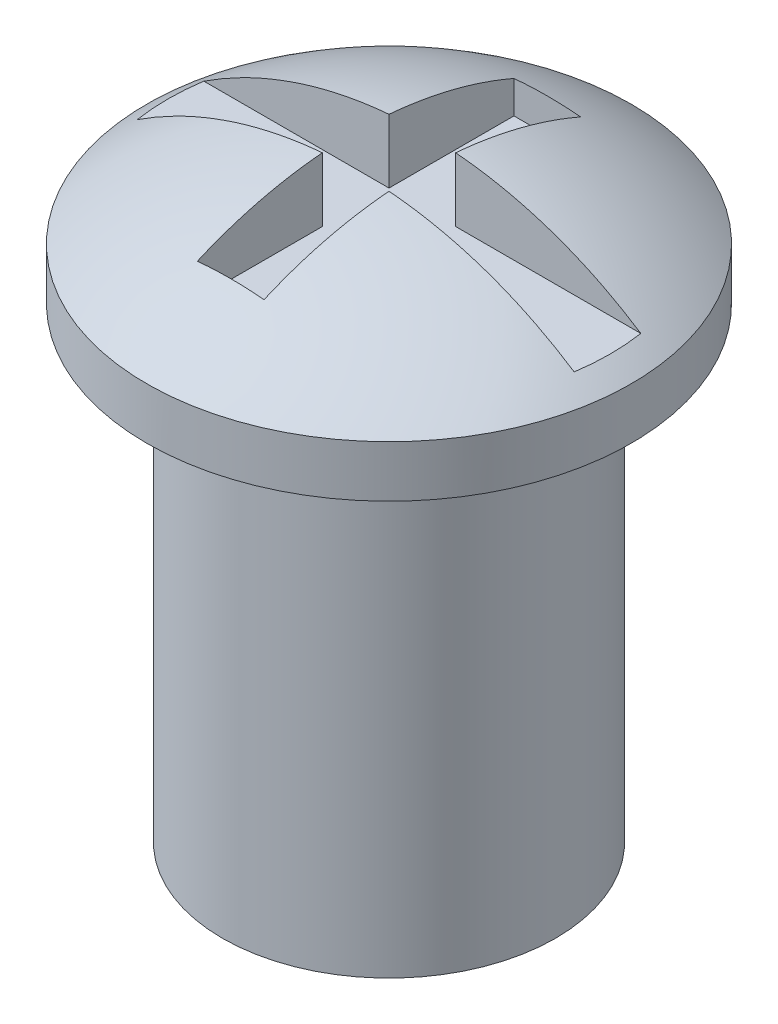
ISO-10303-21;
HEADER;
FILE_DESCRIPTION(('STEP AP214'),'2;1');
FILE_NAME('part.step','',(''),(''),'','','');
FILE_SCHEMA(('AUTOMOTIVE_DESIGN { 1 0 10303 214 1 1 1 1 }'));
ENDSEC;
DATA;
#1=APPLICATION_CONTEXT('core data for automotive mechanical design processes');
#2=APPLICATION_PROTOCOL_DEFINITION('international standard','automotive_design',2000,#1);
#3=PRODUCT_CONTEXT('',#1,'mechanical');
#4=PRODUCT('Part','Part','',(#3));
#5=PRODUCT_RELATED_PRODUCT_CATEGORY('part','',(#4));
#6=PRODUCT_DEFINITION_FORMATION('','',#4);
#7=PRODUCT_DEFINITION_CONTEXT('part definition',#1,'design');
#8=PRODUCT_DEFINITION('design','',#6,#7);
#9=PRODUCT_DEFINITION_SHAPE('','',#8);
#10=(LENGTH_UNIT() NAMED_UNIT(*) SI_UNIT(.MILLI.,.METRE.));
#11=(NAMED_UNIT(*) PLANE_ANGLE_UNIT() SI_UNIT($,.RADIAN.));
#12=(NAMED_UNIT(*) SI_UNIT($,.STERADIAN.) SOLID_ANGLE_UNIT());
#13=UNCERTAINTY_MEASURE_WITH_UNIT(LENGTH_MEASURE(1.E-05),#10,'distance_accuracy_value','');
#14=(GEOMETRIC_REPRESENTATION_CONTEXT(3) GLOBAL_UNCERTAINTY_ASSIGNED_CONTEXT((#13)) GLOBAL_UNIT_ASSIGNED_CONTEXT((#10,
#11,#12)) REPRESENTATION_CONTEXT('',''));
#15=CARTESIAN_POINT('',(0.,0.,0.));
#16=DIRECTION('',(0.,0.,1.));
#17=DIRECTION('',(1.,0.,0.));
#18=AXIS2_PLACEMENT_3D('',#15,#16,#17);
#19=CARTESIAN_POINT('',(0.,9.,0.));
#20=DIRECTION('',(0.,-1.,0.));
#21=DIRECTION('',(0.,0.,-1.));
#22=AXIS2_PLACEMENT_3D('',#19,#20,#21);
#23=CYLINDRICAL_SURFACE('',#22,3.635);
#24=CARTESIAN_POINT('',(0.,7.,0.));
#25=DIRECTION('',(0.,1.,0.));
#26=DIRECTION('',(0.,0.,1.));
#27=AXIS2_PLACEMENT_3D('',#24,#25,#26);
#28=CIRCLE('',#27,3.635);
#29=CARTESIAN_POINT('',(0.,7.,3.635));
#30=VERTEX_POINT('',#29);
#31=EDGE_CURVE('E149',#30,#30,#28,.T.);
#32=ORIENTED_EDGE('',*,*,#31,.T.);
#33=EDGE_LOOP('',(#32));
#34=FACE_BOUND('',#33,.T.);
#35=CARTESIAN_POINT('',(0.,7.77354951791641,0.));
#36=DIRECTION('',(0.,-1.,0.));
#37=DIRECTION('',(0.,0.,-1.));
#38=AXIS2_PLACEMENT_3D('',#35,#36,#37);
#39=CIRCLE('',#38,3.635);
#40=CARTESIAN_POINT('',(0.,7.77354951791641,-3.635));
#41=VERTEX_POINT('',#40);
#42=EDGE_CURVE('E175',#41,#41,#39,.F.);
#43=ORIENTED_EDGE('',*,*,#42,.F.);
#44=EDGE_LOOP('',(#43));
#45=FACE_BOUND('',#44,.T.);
#46=ADVANCED_FACE('F33',(#34,#45),#23,.T.);
#47=CARTESIAN_POINT('',(0.,7.,0.));
#48=DIRECTION('',(0.,-1.,0.));
#49=DIRECTION('',(0.,0.,-1.));
#50=AXIS2_PLACEMENT_3D('',#47,#48,#49);
#51=CYLINDRICAL_SURFACE('',#50,2.5);
#52=CARTESIAN_POINT('',(0.,7.,0.));
#53=DIRECTION('',(0.,1.,0.));
#54=DIRECTION('',(0.,0.,1.));
#55=AXIS2_PLACEMENT_3D('',#52,#53,#54);
#56=CIRCLE('',#55,2.5);
#57=CARTESIAN_POINT('',(0.,7.,2.5));
#58=VERTEX_POINT('',#57);
#59=EDGE_CURVE('E153',#58,#58,#56,.T.);
#60=ORIENTED_EDGE('',*,*,#59,.F.);
#61=EDGE_LOOP('',(#60));
#62=FACE_BOUND('',#61,.T.);
#63=CARTESIAN_POINT('',(0.,0.,0.));
#64=DIRECTION('',(0.,1.,0.));
#65=DIRECTION('',(0.,0.,1.));
#66=AXIS2_PLACEMENT_3D('',#63,#64,#65);
#67=CIRCLE('',#66,2.5);
#68=CARTESIAN_POINT('',(0.,0.,2.5));
#69=VERTEX_POINT('',#68);
#70=EDGE_CURVE('E152',#69,#69,#67,.T.);
#71=ORIENTED_EDGE('',*,*,#70,.T.);
#72=EDGE_LOOP('',(#71));
#73=FACE_BOUND('',#72,.T.);
#74=ADVANCED_FACE('F35',(#62,#73),#51,.T.);
#75=CARTESIAN_POINT('',(0.,0.,0.));
#76=DIRECTION('',(0.,1.,0.));
#77=DIRECTION('',(0.,0.,1.));
#78=AXIS2_PLACEMENT_3D('',#75,#76,#77);
#79=PLANE('',#78);
#80=ORIENTED_EDGE('',*,*,#70,.F.);
#81=EDGE_LOOP('',(#80));
#82=FACE_BOUND('',#81,.T.);
#83=ADVANCED_FACE('F237',(#82),#79,.F.);
#84=CARTESIAN_POINT('',(0.,7.,0.));
#85=DIRECTION('',(0.,1.,0.));
#86=DIRECTION('',(0.,0.,1.));
#87=AXIS2_PLACEMENT_3D('',#84,#85,#86);
#88=PLANE('',#87);
#89=ORIENTED_EDGE('',*,*,#31,.F.);
#90=EDGE_LOOP('',(#89));
#91=FACE_BOUND('',#90,.T.);
#92=ORIENTED_EDGE('',*,*,#59,.T.);
#93=EDGE_LOOP('',(#92));
#94=FACE_BOUND('',#93,.T.);
#95=ADVANCED_FACE('F240',(#91,#94),#88,.F.);
#96=CARTESIAN_POINT('',(0.,3.,0.));
#97=DIRECTION('',(0.,-1.,0.));
#98=DIRECTION('',(0.,0.,1.));
#99=AXIS2_PLACEMENT_3D('',#96,#97,#98);
#100=SPHERICAL_SURFACE('',#99,6.);
#101=CARTESIAN_POINT('',(0.,3.,2.375));
#102=DIRECTION('',(0.,0.,1.));
#103=DIRECTION('',(1.,0.,0.));
#104=AXIS2_PLACEMENT_3D('',#101,#102,#103);
#105=CIRCLE('',#104,5.50993421013355);
#106=CARTESIAN_POINT('',(0.499999999999999,8.48720101691199,2.375));
#107=VERTEX_POINT('',#106);
#108=CARTESIAN_POINT('',(-0.499999999999999,8.48720101691199,2.375));
#109=VERTEX_POINT('',#108);
#110=EDGE_CURVE('E179',#107,#109,#105,.T.);
#111=ORIENTED_EDGE('',*,*,#110,.T.);
#112=CARTESIAN_POINT('',(-0.5,3.,0.));
#113=DIRECTION('',(-1.,0.,0.));
#114=DIRECTION('',(0.,0.,1.));
#115=AXIS2_PLACEMENT_3D('',#112,#113,#114);
#116=CIRCLE('',#115,5.9791303715507);
#117=CARTESIAN_POINT('',(-0.5,8.95818764390649,0.5));
#118=VERTEX_POINT('',#117);
#119=EDGE_CURVE('E204',#109,#118,#116,.T.);
#120=ORIENTED_EDGE('',*,*,#119,.T.);
#121=CARTESIAN_POINT('',(0.,3.,0.5));
#122=DIRECTION('',(0.,0.,1.));
#123=DIRECTION('',(1.,0.,0.));
#124=AXIS2_PLACEMENT_3D('',#121,#122,#123);
#125=CIRCLE('',#124,5.9791303715507);
#126=CARTESIAN_POINT('',(-3.278719262151,8.,0.5));
#127=VERTEX_POINT('',#126);
#128=EDGE_CURVE('E167',#118,#127,#125,.T.);
#129=ORIENTED_EDGE('',*,*,#128,.T.);
#130=CARTESIAN_POINT('',(0.,8.,0.));
#131=DIRECTION('',(0.,1.,0.));
#132=DIRECTION('',(0.,0.,1.));
#133=AXIS2_PLACEMENT_3D('',#130,#131,#132);
#134=CIRCLE('',#133,3.3166247903554);
#135=CARTESIAN_POINT('',(-3.278719262151,8.,-0.5));
#136=VERTEX_POINT('',#135);
#137=EDGE_CURVE('E197',#136,#127,#134,.T.);
#138=ORIENTED_EDGE('',*,*,#137,.F.);
#139=CARTESIAN_POINT('',(0.,3.,-0.5));
#140=DIRECTION('',(0.,0.,-1.));
#141=DIRECTION('',(-1.,0.,0.));
#142=AXIS2_PLACEMENT_3D('',#139,#140,#141);
#143=CIRCLE('',#142,5.9791303715507);
#144=CARTESIAN_POINT('',(-0.5,8.95818764390649,-0.5));
#145=VERTEX_POINT('',#144);
#146=EDGE_CURVE('E195',#136,#145,#143,.T.);
#147=ORIENTED_EDGE('',*,*,#146,.T.);
#148=CARTESIAN_POINT('',(-0.5,3.,0.));
#149=DIRECTION('',(-1.,0.,0.));
#150=DIRECTION('',(0.,0.,1.));
#151=AXIS2_PLACEMENT_3D('',#148,#149,#150);
#152=CIRCLE('',#151,5.9791303715507);
#153=CARTESIAN_POINT('',(-0.5,8.48720101691199,-2.375));
#154=VERTEX_POINT('',#153);
#155=EDGE_CURVE('E47',#145,#154,#152,.T.);
#156=ORIENTED_EDGE('',*,*,#155,.T.);
#157=CARTESIAN_POINT('',(0.,3.,-2.375));
#158=DIRECTION('',(0.,0.,-1.));
#159=DIRECTION('',(-1.,0.,0.));
#160=AXIS2_PLACEMENT_3D('',#157,#158,#159);
#161=CIRCLE('',#160,5.50993421013355);
#162=CARTESIAN_POINT('',(0.5,8.48720101691199,-2.375));
#163=VERTEX_POINT('',#162);
#164=EDGE_CURVE('E11',#154,#163,#161,.T.);
#165=ORIENTED_EDGE('',*,*,#164,.T.);
#166=CARTESIAN_POINT('',(0.5,3.,0.));
#167=DIRECTION('',(1.,0.,0.));
#168=DIRECTION('',(0.,0.,-1.));
#169=AXIS2_PLACEMENT_3D('',#166,#167,#168);
#170=CIRCLE('',#169,5.9791303715507);
#171=CARTESIAN_POINT('',(0.5,8.95818764390649,-0.5));
#172=VERTEX_POINT('',#171);
#173=EDGE_CURVE('E111',#163,#172,#170,.T.);
#174=ORIENTED_EDGE('',*,*,#173,.T.);
#175=CARTESIAN_POINT('',(0.,3.,-0.5));
#176=DIRECTION('',(0.,0.,-1.));
#177=DIRECTION('',(-1.,0.,0.));
#178=AXIS2_PLACEMENT_3D('',#175,#176,#177);
#179=CIRCLE('',#178,5.9791303715507);
#180=CARTESIAN_POINT('',(3.278719262151,8.,-0.5));
#181=VERTEX_POINT('',#180);
#182=EDGE_CURVE('E193',#172,#181,#179,.T.);
#183=ORIENTED_EDGE('',*,*,#182,.T.);
#184=CARTESIAN_POINT('',(3.278719262151,8.,0.5));
#185=VERTEX_POINT('',#184);
#186=EDGE_CURVE('E190',#185,#181,#134,.T.);
#187=ORIENTED_EDGE('',*,*,#186,.F.);
#188=CARTESIAN_POINT('',(0.,3.,0.5));
#189=DIRECTION('',(0.,0.,1.));
#190=DIRECTION('',(1.,0.,0.));
#191=AXIS2_PLACEMENT_3D('',#188,#189,#190);
#192=CIRCLE('',#191,5.9791303715507);
#193=CARTESIAN_POINT('',(0.5,8.95818764390649,0.5));
#194=VERTEX_POINT('',#193);
#195=EDGE_CURVE('E201',#185,#194,#192,.T.);
#196=ORIENTED_EDGE('',*,*,#195,.T.);
#197=CARTESIAN_POINT('',(0.5,3.,0.));
#198=DIRECTION('',(1.,0.,0.));
#199=DIRECTION('',(0.,0.,-1.));
#200=AXIS2_PLACEMENT_3D('',#197,#198,#199);
#201=CIRCLE('',#200,5.9791303715507);
#202=EDGE_CURVE('E206',#194,#107,#201,.T.);
#203=ORIENTED_EDGE('',*,*,#202,.T.);
#204=EDGE_LOOP('',(#111,#120,#129,#138,#147,#156,#165,#174,#183,#187,#196,#203));
#205=FACE_BOUND('',#204,.T.);
#206=ORIENTED_EDGE('',*,*,#42,.T.);
#207=EDGE_LOOP('',(#206));
#208=FACE_BOUND('',#207,.T.);
#209=ADVANCED_FACE('F109',(#205,#208),#100,.T.);
#210=CARTESIAN_POINT('',(-0.5,8.,-2.375));
#211=DIRECTION('',(0.,0.,-1.));
#212=DIRECTION('',(-1.,0.,0.));
#213=AXIS2_PLACEMENT_3D('',#210,#211,#212);
#214=PLANE('',#213);
#215=ORIENTED_EDGE('',*,*,#164,.F.);
#216=DIRECTION('',(0.,1.,0.));
#217=VECTOR('',#216,1.);
#218=CARTESIAN_POINT('',(-0.5,8.,-2.375));
#219=LINE('',#218,#217);
#220=CARTESIAN_POINT('',(-0.5,8.,-2.375));
#221=VERTEX_POINT('',#220);
#222=EDGE_CURVE('E128',#221,#154,#219,.T.);
#223=ORIENTED_EDGE('',*,*,#222,.F.);
#224=DIRECTION('',(-1.,0.,0.));
#225=VECTOR('',#224,1.);
#226=CARTESIAN_POINT('',(-0.5,8.,-2.375));
#227=LINE('',#226,#225);
#228=CARTESIAN_POINT('',(0.5,8.,-2.375));
#229=VERTEX_POINT('',#228);
#230=EDGE_CURVE('E127',#229,#221,#227,.T.);
#231=ORIENTED_EDGE('',*,*,#230,.F.);
#232=DIRECTION('',(0.,1.,0.));
#233=VECTOR('',#232,1.);
#234=CARTESIAN_POINT('',(0.5,8.,-2.375));
#235=LINE('',#234,#233);
#236=EDGE_CURVE('E121',#229,#163,#235,.T.);
#237=ORIENTED_EDGE('',*,*,#236,.T.);
#238=EDGE_LOOP('',(#215,#223,#231,#237));
#239=FACE_BOUND('',#238,.T.);
#240=ADVANCED_FACE('F126',(#239),#214,.F.);
#241=CARTESIAN_POINT('',(0.5,8.,-2.375));
#242=DIRECTION('',(1.,0.,0.));
#243=DIRECTION('',(0.,0.,-1.));
#244=AXIS2_PLACEMENT_3D('',#241,#242,#243);
#245=PLANE('',#244);
#246=ORIENTED_EDGE('',*,*,#173,.F.);
#247=ORIENTED_EDGE('',*,*,#236,.F.);
#248=DIRECTION('',(0.,0.,-1.));
#249=VECTOR('',#248,1.);
#250=CARTESIAN_POINT('',(0.5,8.,-2.375));
#251=LINE('',#250,#249);
#252=CARTESIAN_POINT('',(0.5,8.,-0.5));
#253=VERTEX_POINT('',#252);
#254=EDGE_CURVE('E184',#253,#229,#251,.T.);
#255=ORIENTED_EDGE('',*,*,#254,.F.);
#256=DIRECTION('',(0.,-1.,0.));
#257=VECTOR('',#256,1.);
#258=CARTESIAN_POINT('',(0.5,8.,-0.5));
#259=LINE('',#258,#257);
#260=EDGE_CURVE('E124',#172,#253,#259,.T.);
#261=ORIENTED_EDGE('',*,*,#260,.F.);
#262=EDGE_LOOP('',(#246,#247,#255,#261));
#263=FACE_BOUND('',#262,.T.);
#264=ADVANCED_FACE('F119',(#263),#245,.F.);
#265=CARTESIAN_POINT('',(-0.5,8.,-2.375));
#266=DIRECTION('',(-1.,0.,0.));
#267=DIRECTION('',(0.,0.,1.));
#268=AXIS2_PLACEMENT_3D('',#265,#266,#267);
#269=PLANE('',#268);
#270=ORIENTED_EDGE('',*,*,#155,.F.);
#271=DIRECTION('',(0.,1.,0.));
#272=VECTOR('',#271,1.);
#273=CARTESIAN_POINT('',(-0.5,8.,-0.5));
#274=LINE('',#273,#272);
#275=CARTESIAN_POINT('',(-0.5,8.,-0.5));
#276=VERTEX_POINT('',#275);
#277=EDGE_CURVE('E140',#276,#145,#274,.T.);
#278=ORIENTED_EDGE('',*,*,#277,.F.);
#279=DIRECTION('',(0.,0.,1.));
#280=VECTOR('',#279,1.);
#281=CARTESIAN_POINT('',(-0.5,8.,-2.375));
#282=LINE('',#281,#280);
#283=EDGE_CURVE('E55',#221,#276,#282,.T.);
#284=ORIENTED_EDGE('',*,*,#283,.F.);
#285=ORIENTED_EDGE('',*,*,#222,.T.);
#286=EDGE_LOOP('',(#270,#278,#284,#285));
#287=FACE_BOUND('',#286,.T.);
#288=ADVANCED_FACE('F264',(#287),#269,.F.);
#289=CARTESIAN_POINT('',(-5.38604232171268,8.,-0.5));
#290=DIRECTION('',(0.,0.,-1.));
#291=DIRECTION('',(-1.,0.,0.));
#292=AXIS2_PLACEMENT_3D('',#289,#290,#291);
#293=PLANE('',#292);
#294=ORIENTED_EDGE('',*,*,#182,.F.);
#295=ORIENTED_EDGE('',*,*,#260,.T.);
#296=DIRECTION('',(-1.,0.,0.));
#297=VECTOR('',#296,1.);
#298=CARTESIAN_POINT('',(-5.38604232171268,8.,-0.5));
#299=LINE('',#298,#297);
#300=EDGE_CURVE('E147',#181,#253,#299,.T.);
#301=ORIENTED_EDGE('',*,*,#300,.F.);
#302=EDGE_LOOP('',(#294,#295,#301));
#303=FACE_BOUND('',#302,.T.);
#304=ADVANCED_FACE('F192',(#303),#293,.F.);
#305=CARTESIAN_POINT('',(-0.499999999999999,8.,2.375));
#306=DIRECTION('',(0.,0.,1.));
#307=DIRECTION('',(1.,0.,0.));
#308=AXIS2_PLACEMENT_3D('',#305,#306,#307);
#309=PLANE('',#308);
#310=ORIENTED_EDGE('',*,*,#110,.F.);
#311=DIRECTION('',(0.,1.,0.));
#312=VECTOR('',#311,1.);
#313=CARTESIAN_POINT('',(0.499999999999999,8.,2.375));
#314=LINE('',#313,#312);
#315=CARTESIAN_POINT('',(0.499999999999999,8.,2.375));
#316=VERTEX_POINT('',#315);
#317=EDGE_CURVE('E129',#316,#107,#314,.T.);
#318=ORIENTED_EDGE('',*,*,#317,.F.);
#319=DIRECTION('',(1.,0.,0.));
#320=VECTOR('',#319,1.);
#321=CARTESIAN_POINT('',(-0.499999999999999,8.,2.375));
#322=LINE('',#321,#320);
#323=CARTESIAN_POINT('',(-0.499999999999999,8.,2.375));
#324=VERTEX_POINT('',#323);
#325=EDGE_CURVE('E177',#324,#316,#322,.T.);
#326=ORIENTED_EDGE('',*,*,#325,.F.);
#327=DIRECTION('',(0.,1.,0.));
#328=VECTOR('',#327,1.);
#329=CARTESIAN_POINT('',(-0.499999999999999,8.,2.375));
#330=LINE('',#329,#328);
#331=EDGE_CURVE('E133',#324,#109,#330,.T.);
#332=ORIENTED_EDGE('',*,*,#331,.T.);
#333=EDGE_LOOP('',(#310,#318,#326,#332));
#334=FACE_BOUND('',#333,.T.);
#335=ADVANCED_FACE('F210',(#334),#309,.F.);
#336=ORIENTED_EDGE('',*,*,#119,.F.);
#337=ORIENTED_EDGE('',*,*,#331,.F.);
#338=CARTESIAN_POINT('',(-0.499999999999999,8.,0.5));
#339=VERTEX_POINT('',#338);
#340=EDGE_CURVE('E171',#339,#324,#282,.T.);
#341=ORIENTED_EDGE('',*,*,#340,.F.);
#342=DIRECTION('',(0.,-1.,0.));
#343=VECTOR('',#342,1.);
#344=CARTESIAN_POINT('',(-0.5,8.,0.5));
#345=LINE('',#344,#343);
#346=EDGE_CURVE('E41',#118,#339,#345,.T.);
#347=ORIENTED_EDGE('',*,*,#346,.F.);
#348=EDGE_LOOP('',(#336,#337,#341,#347));
#349=FACE_BOUND('',#348,.T.);
#350=ADVANCED_FACE('F172',(#349),#269,.F.);
#351=ORIENTED_EDGE('',*,*,#202,.F.);
#352=DIRECTION('',(0.,1.,0.));
#353=VECTOR('',#352,1.);
#354=CARTESIAN_POINT('',(0.5,8.,0.5));
#355=LINE('',#354,#353);
#356=CARTESIAN_POINT('',(0.5,8.,0.5));
#357=VERTEX_POINT('',#356);
#358=EDGE_CURVE('E156',#357,#194,#355,.T.);
#359=ORIENTED_EDGE('',*,*,#358,.F.);
#360=EDGE_CURVE('E185',#316,#357,#251,.T.);
#361=ORIENTED_EDGE('',*,*,#360,.F.);
#362=ORIENTED_EDGE('',*,*,#317,.T.);
#363=EDGE_LOOP('',(#351,#359,#361,#362));
#364=FACE_BOUND('',#363,.T.);
#365=ADVANCED_FACE('F215',(#364),#245,.F.);
#366=CARTESIAN_POINT('',(-5.38604232171268,8.,0.5));
#367=DIRECTION('',(0.,0.,1.));
#368=DIRECTION('',(1.,0.,0.));
#369=AXIS2_PLACEMENT_3D('',#366,#367,#368);
#370=PLANE('',#369);
#371=ORIENTED_EDGE('',*,*,#195,.F.);
#372=DIRECTION('',(1.,0.,0.));
#373=VECTOR('',#372,1.);
#374=CARTESIAN_POINT('',(-5.38604232171268,8.,0.5));
#375=LINE('',#374,#373);
#376=EDGE_CURVE('E143',#357,#185,#375,.T.);
#377=ORIENTED_EDGE('',*,*,#376,.F.);
#378=ORIENTED_EDGE('',*,*,#358,.T.);
#379=EDGE_LOOP('',(#371,#377,#378));
#380=FACE_BOUND('',#379,.T.);
#381=ADVANCED_FACE('F218',(#380),#370,.F.);
#382=CARTESIAN_POINT('',(-5.38604232171268,8.,0.5));
#383=DIRECTION('',(0.,1.,0.));
#384=DIRECTION('',(0.,0.,1.));
#385=AXIS2_PLACEMENT_3D('',#382,#383,#384);
#386=PLANE('',#385);
#387=ORIENTED_EDGE('',*,*,#376,.T.);
#388=ORIENTED_EDGE('',*,*,#186,.T.);
#389=ORIENTED_EDGE('',*,*,#300,.T.);
#390=ORIENTED_EDGE('',*,*,#254,.T.);
#391=ORIENTED_EDGE('',*,*,#230,.T.);
#392=ORIENTED_EDGE('',*,*,#283,.T.);
#393=EDGE_CURVE('E146',#276,#136,#299,.T.);
#394=ORIENTED_EDGE('',*,*,#393,.T.);
#395=ORIENTED_EDGE('',*,*,#137,.T.);
#396=EDGE_CURVE('E144',#127,#339,#375,.T.);
#397=ORIENTED_EDGE('',*,*,#396,.T.);
#398=ORIENTED_EDGE('',*,*,#340,.T.);
#399=ORIENTED_EDGE('',*,*,#325,.T.);
#400=ORIENTED_EDGE('',*,*,#360,.T.);
#401=EDGE_LOOP('',(#387,#388,#389,#390,#391,#392,#394,#395,#397,#398,#399,#400));
#402=FACE_BOUND('',#401,.T.);
#403=ADVANCED_FACE('F187',(#402),#386,.T.);
#404=ORIENTED_EDGE('',*,*,#128,.F.);
#405=ORIENTED_EDGE('',*,*,#346,.T.);
#406=ORIENTED_EDGE('',*,*,#396,.F.);
#407=EDGE_LOOP('',(#404,#405,#406));
#408=FACE_BOUND('',#407,.T.);
#409=ADVANCED_FACE('F166',(#408),#370,.F.);
#410=ORIENTED_EDGE('',*,*,#146,.F.);
#411=ORIENTED_EDGE('',*,*,#393,.F.);
#412=ORIENTED_EDGE('',*,*,#277,.T.);
#413=EDGE_LOOP('',(#410,#411,#412));
#414=FACE_BOUND('',#413,.T.);
#415=ADVANCED_FACE('F230',(#414),#293,.F.);
#416=CLOSED_SHELL('',(#46,#74,#83,#95,#209,#240,#264,#288,#304,#335,#350,#365,#381,#403,#409,#415));
#417=MANIFOLD_SOLID_BREP('B2',#416);
#418=ADVANCED_BREP_SHAPE_REPRESENTATION('',(#18,#417),#14);
#419=SHAPE_DEFINITION_REPRESENTATION(#9,#418);
ENDSEC;
END-ISO-10303-21;
